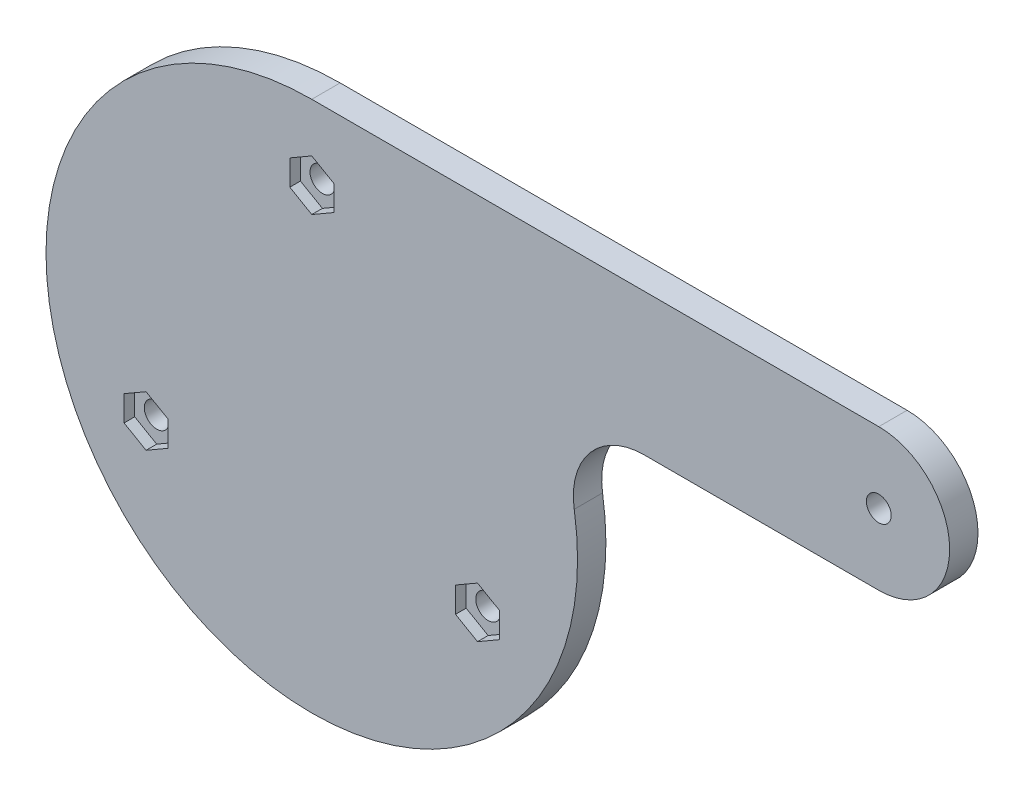
ISO-10303-21;
HEADER;
FILE_DESCRIPTION(('STEP AP214'),'2;1');
FILE_NAME('part.step','',(''),(''),'','','');
FILE_SCHEMA(('AUTOMOTIVE_DESIGN { 1 0 10303 214 1 1 1 1 }'));
ENDSEC;
DATA;
#1=APPLICATION_CONTEXT('core data for automotive mechanical design processes');
#2=APPLICATION_PROTOCOL_DEFINITION('international standard','automotive_design',2000,#1);
#3=PRODUCT_CONTEXT('',#1,'mechanical');
#4=PRODUCT('Part','Part','',(#3));
#5=PRODUCT_RELATED_PRODUCT_CATEGORY('part','',(#4));
#6=PRODUCT_DEFINITION_FORMATION('','',#4);
#7=PRODUCT_DEFINITION_CONTEXT('part definition',#1,'design');
#8=PRODUCT_DEFINITION('design','',#6,#7);
#9=PRODUCT_DEFINITION_SHAPE('','',#8);
#10=(LENGTH_UNIT() NAMED_UNIT(*) SI_UNIT(.MILLI.,.METRE.));
#11=(NAMED_UNIT(*) PLANE_ANGLE_UNIT() SI_UNIT($,.RADIAN.));
#12=(NAMED_UNIT(*) SI_UNIT($,.STERADIAN.) SOLID_ANGLE_UNIT());
#13=UNCERTAINTY_MEASURE_WITH_UNIT(LENGTH_MEASURE(1.E-05),#10,'distance_accuracy_value','');
#14=(GEOMETRIC_REPRESENTATION_CONTEXT(3) GLOBAL_UNCERTAINTY_ASSIGNED_CONTEXT((#13)) GLOBAL_UNIT_ASSIGNED_CONTEXT((#10,
#11,#12)) REPRESENTATION_CONTEXT('',''));
#15=CARTESIAN_POINT('',(0.,0.,0.));
#16=DIRECTION('',(0.,0.,1.));
#17=DIRECTION('',(1.,0.,0.));
#18=AXIS2_PLACEMENT_3D('',#15,#16,#17);
#19=CARTESIAN_POINT('',(46.9041575982343,7.5,4.));
#20=DIRECTION('',(0.,0.,-1.));
#21=DIRECTION('',(-1.,0.,0.));
#22=AXIS2_PLACEMENT_3D('',#19,#20,#21);
#23=CYLINDRICAL_SURFACE('',#22,10.);
#24=CARTESIAN_POINT('',(46.9041575982343,7.5,0.));
#25=DIRECTION('',(0.,0.,1.));
#26=DIRECTION('',(1.,0.,0.));
#27=AXIS2_PLACEMENT_3D('',#24,#25,#26);
#28=CIRCLE('',#27,10.);
#29=CARTESIAN_POINT('',(46.9041575982343,17.5,0.));
#30=VERTEX_POINT('',#29);
#31=CARTESIAN_POINT('',(37.0295981038692,5.92105263157895,0.));
#32=VERTEX_POINT('',#31);
#33=EDGE_CURVE('E244',#30,#32,#28,.T.);
#34=ORIENTED_EDGE('',*,*,#33,.F.);
#35=DIRECTION('',(0.,0.,-1.));
#36=VECTOR('',#35,1.);
#37=CARTESIAN_POINT('',(46.9041575982343,17.5,4.));
#38=LINE('',#37,#36);
#39=CARTESIAN_POINT('',(46.9041575982343,17.5,4.));
#40=VERTEX_POINT('',#39);
#41=EDGE_CURVE('E11',#40,#30,#38,.T.);
#42=ORIENTED_EDGE('',*,*,#41,.F.);
#43=CARTESIAN_POINT('',(46.9041575982343,7.5,4.));
#44=DIRECTION('',(0.,0.,1.));
#45=DIRECTION('',(1.,0.,0.));
#46=AXIS2_PLACEMENT_3D('',#43,#44,#45);
#47=CIRCLE('',#46,10.);
#48=CARTESIAN_POINT('',(37.0295981038692,5.92105263157895,4.));
#49=VERTEX_POINT('',#48);
#50=EDGE_CURVE('E345',#40,#49,#47,.T.);
#51=ORIENTED_EDGE('',*,*,#50,.T.);
#52=DIRECTION('',(0.,0.,-1.));
#53=VECTOR('',#52,1.);
#54=CARTESIAN_POINT('',(37.0295981038692,5.92105263157895,4.));
#55=LINE('',#54,#53);
#56=EDGE_CURVE('E359',#49,#32,#55,.T.);
#57=ORIENTED_EDGE('',*,*,#56,.T.);
#58=EDGE_LOOP('',(#34,#42,#51,#57));
#59=FACE_BOUND('',#58,.T.);
#60=ADVANCED_FACE('F38',(#59),#23,.F.);
#61=CARTESIAN_POINT('',(0.,17.5,4.));
#62=DIRECTION('',(0.,-1.,0.));
#63=DIRECTION('',(1.,0.,0.));
#64=AXIS2_PLACEMENT_3D('',#61,#62,#63);
#65=PLANE('',#64);
#66=DIRECTION('',(-1.,0.,0.));
#67=VECTOR('',#66,1.);
#68=CARTESIAN_POINT('',(0.,17.5,0.));
#69=LINE('',#68,#67);
#70=CARTESIAN_POINT('',(80.,17.5,0.));
#71=VERTEX_POINT('',#70);
#72=EDGE_CURVE('E362',#71,#30,#69,.T.);
#73=ORIENTED_EDGE('',*,*,#72,.F.);
#74=DIRECTION('',(0.,0.,-1.));
#75=VECTOR('',#74,1.);
#76=CARTESIAN_POINT('',(80.,17.5,4.));
#77=LINE('',#76,#75);
#78=CARTESIAN_POINT('',(80.,17.5,4.));
#79=VERTEX_POINT('',#78);
#80=EDGE_CURVE('E46',#79,#71,#77,.T.);
#81=ORIENTED_EDGE('',*,*,#80,.F.);
#82=DIRECTION('',(-1.,0.,0.));
#83=VECTOR('',#82,1.);
#84=CARTESIAN_POINT('',(0.,17.5,4.));
#85=LINE('',#84,#83);
#86=EDGE_CURVE('E348',#79,#40,#85,.T.);
#87=ORIENTED_EDGE('',*,*,#86,.T.);
#88=ORIENTED_EDGE('',*,*,#41,.T.);
#89=EDGE_LOOP('',(#73,#81,#87,#88));
#90=FACE_BOUND('',#89,.T.);
#91=ADVANCED_FACE('F417',(#90),#65,.T.);
#92=CARTESIAN_POINT('',(80.,27.5,4.));
#93=DIRECTION('',(0.,0.,-1.));
#94=DIRECTION('',(-1.,0.,0.));
#95=AXIS2_PLACEMENT_3D('',#92,#93,#94);
#96=CYLINDRICAL_SURFACE('',#95,9.99999999999999);
#97=CARTESIAN_POINT('',(80.,27.5,0.));
#98=DIRECTION('',(0.,0.,1.));
#99=DIRECTION('',(1.,0.,0.));
#100=AXIS2_PLACEMENT_3D('',#97,#98,#99);
#101=CIRCLE('',#100,9.99999999999999);
#102=CARTESIAN_POINT('',(80.,37.5,0.));
#103=VERTEX_POINT('',#102);
#104=EDGE_CURVE('E365',#71,#103,#101,.T.);
#105=ORIENTED_EDGE('',*,*,#104,.T.);
#106=DIRECTION('',(0.,0.,-1.));
#107=VECTOR('',#106,1.);
#108=CARTESIAN_POINT('',(80.,37.5,4.));
#109=LINE('',#108,#107);
#110=CARTESIAN_POINT('',(80.,37.5,4.));
#111=VERTEX_POINT('',#110);
#112=EDGE_CURVE('E376',#111,#103,#109,.T.);
#113=ORIENTED_EDGE('',*,*,#112,.F.);
#114=CARTESIAN_POINT('',(80.,27.5,4.));
#115=DIRECTION('',(0.,0.,1.));
#116=DIRECTION('',(1.,0.,0.));
#117=AXIS2_PLACEMENT_3D('',#114,#115,#116);
#118=CIRCLE('',#117,9.99999999999999);
#119=EDGE_CURVE('E352',#79,#111,#118,.T.);
#120=ORIENTED_EDGE('',*,*,#119,.F.);
#121=ORIENTED_EDGE('',*,*,#80,.T.);
#122=EDGE_LOOP('',(#105,#113,#120,#121));
#123=FACE_BOUND('',#122,.T.);
#124=ADVANCED_FACE('F422',(#123),#96,.T.);
#125=CARTESIAN_POINT('',(0.,37.5,4.));
#126=DIRECTION('',(0.,1.,0.));
#127=DIRECTION('',(0.,0.,1.));
#128=AXIS2_PLACEMENT_3D('',#125,#126,#127);
#129=PLANE('',#128);
#130=DIRECTION('',(1.,0.,0.));
#131=VECTOR('',#130,1.);
#132=CARTESIAN_POINT('',(0.,37.5,0.));
#133=LINE('',#132,#131);
#134=CARTESIAN_POINT('',(0.,37.5,0.));
#135=VERTEX_POINT('',#134);
#136=EDGE_CURVE('E368',#135,#103,#133,.T.);
#137=ORIENTED_EDGE('',*,*,#136,.F.);
#138=DIRECTION('',(0.,0.,-1.));
#139=VECTOR('',#138,1.);
#140=CARTESIAN_POINT('',(0.,37.5,4.));
#141=LINE('',#140,#139);
#142=CARTESIAN_POINT('',(0.,37.5,4.));
#143=VERTEX_POINT('',#142);
#144=EDGE_CURVE('E374',#143,#135,#141,.T.);
#145=ORIENTED_EDGE('',*,*,#144,.F.);
#146=DIRECTION('',(1.,0.,0.));
#147=VECTOR('',#146,1.);
#148=CARTESIAN_POINT('',(0.,37.5,4.));
#149=LINE('',#148,#147);
#150=EDGE_CURVE('E354',#143,#111,#149,.T.);
#151=ORIENTED_EDGE('',*,*,#150,.T.);
#152=ORIENTED_EDGE('',*,*,#112,.T.);
#153=EDGE_LOOP('',(#137,#145,#151,#152));
#154=FACE_BOUND('',#153,.T.);
#155=ADVANCED_FACE('F442',(#154),#129,.T.);
#156=CARTESIAN_POINT('',(0.,0.,4.));
#157=DIRECTION('',(0.,0.,-1.));
#158=DIRECTION('',(-1.,0.,0.));
#159=AXIS2_PLACEMENT_3D('',#156,#157,#158);
#160=CYLINDRICAL_SURFACE('',#159,37.5);
#161=CARTESIAN_POINT('',(0.,0.,0.));
#162=DIRECTION('',(0.,0.,1.));
#163=DIRECTION('',(1.,0.,0.));
#164=AXIS2_PLACEMENT_3D('',#161,#162,#163);
#165=CIRCLE('',#164,37.5);
#166=EDGE_CURVE('E349',#135,#32,#165,.T.);
#167=ORIENTED_EDGE('',*,*,#166,.T.);
#168=ORIENTED_EDGE('',*,*,#56,.F.);
#169=CARTESIAN_POINT('',(0.,0.,4.));
#170=DIRECTION('',(0.,0.,1.));
#171=DIRECTION('',(1.,0.,0.));
#172=AXIS2_PLACEMENT_3D('',#169,#170,#171);
#173=CIRCLE('',#172,37.5);
#174=EDGE_CURVE('E357',#143,#49,#173,.T.);
#175=ORIENTED_EDGE('',*,*,#174,.F.);
#176=ORIENTED_EDGE('',*,*,#144,.T.);
#177=EDGE_LOOP('',(#167,#168,#175,#176));
#178=FACE_BOUND('',#177,.T.);
#179=ADVANCED_FACE('F439',(#178),#160,.T.);
#180=CARTESIAN_POINT('',(0.,0.,4.));
#181=DIRECTION('',(0.,0.,1.));
#182=DIRECTION('',(1.,0.,0.));
#183=AXIS2_PLACEMENT_3D('',#180,#181,#182);
#184=PLANE('',#183);
#185=CARTESIAN_POINT('',(80.,27.5,4.));
#186=DIRECTION('',(0.,0.,1.));
#187=DIRECTION('',(1.,0.,0.));
#188=AXIS2_PLACEMENT_3D('',#185,#186,#187);
#189=CIRCLE('',#188,1.75);
#190=CARTESIAN_POINT('',(81.75,27.5,4.));
#191=VERTEX_POINT('',#190);
#192=EDGE_CURVE('E397',#191,#191,#189,.T.);
#193=ORIENTED_EDGE('',*,*,#192,.F.);
#194=EDGE_LOOP('',(#193));
#195=FACE_BOUND('',#194,.T.);
#196=DIRECTION('',(0.866025403784438,0.5,0.));
#197=VECTOR('',#196,1.);
#198=CARTESIAN_POINT('',(23.3826859021808,-17.0799999999994,4.));
#199=LINE('',#198,#197);
#200=CARTESIAN_POINT('',(23.3826859021808,-17.0799999999994,4.));
#201=VERTEX_POINT('',#200);
#202=CARTESIAN_POINT('',(26.4830568477291,-15.2899999999994,4.));
#203=VERTEX_POINT('',#202);
#204=EDGE_CURVE('E54',#201,#203,#199,.T.);
#205=ORIENTED_EDGE('',*,*,#204,.F.);
#206=DIRECTION('',(0.866025403784439,-0.5,0.));
#207=VECTOR('',#206,1.);
#208=CARTESIAN_POINT('',(20.2823149566325,-15.2899999999994,4.));
#209=LINE('',#208,#207);
#210=CARTESIAN_POINT('',(20.2823149566325,-15.2899999999994,4.));
#211=VERTEX_POINT('',#210);
#212=EDGE_CURVE('E214',#211,#201,#209,.T.);
#213=ORIENTED_EDGE('',*,*,#212,.F.);
#214=DIRECTION('',(0.,-1.,0.));
#215=VECTOR('',#214,1.);
#216=CARTESIAN_POINT('',(20.2823149566325,-11.7099999999994,4.));
#217=LINE('',#216,#215);
#218=CARTESIAN_POINT('',(20.2823149566325,-11.7099999999994,4.));
#219=VERTEX_POINT('',#218);
#220=EDGE_CURVE('E217',#219,#211,#217,.T.);
#221=ORIENTED_EDGE('',*,*,#220,.F.);
#222=DIRECTION('',(-0.866025403784439,-0.5,0.));
#223=VECTOR('',#222,1.);
#224=CARTESIAN_POINT('',(23.3826859021808,-9.91999999999944,4.));
#225=LINE('',#224,#223);
#226=CARTESIAN_POINT('',(23.3826859021808,-9.91999999999944,4.));
#227=VERTEX_POINT('',#226);
#228=EDGE_CURVE('E237',#227,#219,#225,.T.);
#229=ORIENTED_EDGE('',*,*,#228,.F.);
#230=DIRECTION('',(-0.866025403784439,0.5,0.));
#231=VECTOR('',#230,1.);
#232=CARTESIAN_POINT('',(26.4830568477291,-11.7099999999994,4.));
#233=LINE('',#232,#231);
#234=CARTESIAN_POINT('',(26.4830568477291,-11.7099999999994,4.));
#235=VERTEX_POINT('',#234);
#236=EDGE_CURVE('E234',#235,#227,#233,.T.);
#237=ORIENTED_EDGE('',*,*,#236,.F.);
#238=DIRECTION('',(0.,1.,0.));
#239=VECTOR('',#238,1.);
#240=CARTESIAN_POINT('',(26.4830568477291,-15.2899999999994,4.));
#241=LINE('',#240,#239);
#242=EDGE_CURVE('E231',#203,#235,#241,.T.);
#243=ORIENTED_EDGE('',*,*,#242,.F.);
#244=EDGE_LOOP('',(#205,#213,#221,#229,#237,#243));
#245=FACE_BOUND('',#244,.T.);
#246=DIRECTION('',(-0.866025403784439,0.5,0.));
#247=VECTOR('',#246,1.);
#248=CARTESIAN_POINT('',(3.1003709455483,28.79,4.));
#249=LINE('',#248,#247);
#250=CARTESIAN_POINT('',(3.1003709455483,28.79,4.));
#251=VERTEX_POINT('',#250);
#252=CARTESIAN_POINT('',(0.,30.58,4.));
#253=VERTEX_POINT('',#252);
#254=EDGE_CURVE('E62',#251,#253,#249,.T.);
#255=ORIENTED_EDGE('',*,*,#254,.F.);
#256=DIRECTION('',(0.,1.,0.));
#257=VECTOR('',#256,1.);
#258=CARTESIAN_POINT('',(3.1003709455483,25.21,4.));
#259=LINE('',#258,#257);
#260=CARTESIAN_POINT('',(3.1003709455483,25.21,4.));
#261=VERTEX_POINT('',#260);
#262=EDGE_CURVE('E256',#261,#251,#259,.T.);
#263=ORIENTED_EDGE('',*,*,#262,.F.);
#264=DIRECTION('',(0.866025403784438,0.500000000000001,0.));
#265=VECTOR('',#264,1.);
#266=CARTESIAN_POINT('',(0.,23.42,4.));
#267=LINE('',#266,#265);
#268=CARTESIAN_POINT('',(0.,23.42,4.));
#269=VERTEX_POINT('',#268);
#270=EDGE_CURVE('E283',#269,#261,#267,.T.);
#271=ORIENTED_EDGE('',*,*,#270,.F.);
#272=DIRECTION('',(0.866025403784438,-0.5,0.));
#273=VECTOR('',#272,1.);
#274=CARTESIAN_POINT('',(-3.10037094554829,25.21,4.));
#275=LINE('',#274,#273);
#276=CARTESIAN_POINT('',(-3.10037094554829,25.21,4.));
#277=VERTEX_POINT('',#276);
#278=EDGE_CURVE('E280',#277,#269,#275,.T.);
#279=ORIENTED_EDGE('',*,*,#278,.F.);
#280=DIRECTION('',(0.,-1.,0.));
#281=VECTOR('',#280,1.);
#282=CARTESIAN_POINT('',(-3.10037094554829,28.79,4.));
#283=LINE('',#282,#281);
#284=CARTESIAN_POINT('',(-3.10037094554829,28.79,4.));
#285=VERTEX_POINT('',#284);
#286=EDGE_CURVE('E277',#285,#277,#283,.T.);
#287=ORIENTED_EDGE('',*,*,#286,.F.);
#288=DIRECTION('',(-0.866025403784438,-0.500000000000001,0.));
#289=VECTOR('',#288,1.);
#290=CARTESIAN_POINT('',(0.,30.58,4.));
#291=LINE('',#290,#289);
#292=EDGE_CURVE('E273',#253,#285,#291,.T.);
#293=ORIENTED_EDGE('',*,*,#292,.F.);
#294=EDGE_LOOP('',(#255,#263,#271,#279,#287,#293));
#295=FACE_BOUND('',#294,.T.);
#296=DIRECTION('',(0.,-1.,0.));
#297=VECTOR('',#296,1.);
#298=CARTESIAN_POINT('',(-26.4830568477271,-11.7100000000006,4.));
#299=LINE('',#298,#297);
#300=CARTESIAN_POINT('',(-26.4830568477271,-11.7100000000006,4.));
#301=VERTEX_POINT('',#300);
#302=CARTESIAN_POINT('',(-26.4830568477271,-15.2900000000006,4.));
#303=VERTEX_POINT('',#302);
#304=EDGE_CURVE('E318',#301,#303,#299,.T.);
#305=ORIENTED_EDGE('',*,*,#304,.F.);
#306=DIRECTION('',(-0.866025403784439,-0.5,0.));
#307=VECTOR('',#306,1.);
#308=CARTESIAN_POINT('',(-23.3826859021788,-9.92000000000058,4.));
#309=LINE('',#308,#307);
#310=CARTESIAN_POINT('',(-23.3826859021788,-9.92000000000058,4.));
#311=VERTEX_POINT('',#310);
#312=EDGE_CURVE('E302',#311,#301,#309,.T.);
#313=ORIENTED_EDGE('',*,*,#312,.F.);
#314=DIRECTION('',(-0.866025403784438,0.5,0.));
#315=VECTOR('',#314,1.);
#316=CARTESIAN_POINT('',(-20.2823149566306,-11.7100000000006,4.));
#317=LINE('',#316,#315);
#318=CARTESIAN_POINT('',(-20.2823149566306,-11.7100000000006,4.));
#319=VERTEX_POINT('',#318);
#320=EDGE_CURVE('E329',#319,#311,#317,.T.);
#321=ORIENTED_EDGE('',*,*,#320,.F.);
#322=DIRECTION('',(0.,1.,0.));
#323=VECTOR('',#322,1.);
#324=CARTESIAN_POINT('',(-20.2823149566306,-15.2900000000006,4.));
#325=LINE('',#324,#323);
#326=CARTESIAN_POINT('',(-20.2823149566306,-15.2900000000006,4.));
#327=VERTEX_POINT('',#326);
#328=EDGE_CURVE('E326',#327,#319,#325,.T.);
#329=ORIENTED_EDGE('',*,*,#328,.F.);
#330=DIRECTION('',(0.866025403784438,0.500000000000001,0.));
#331=VECTOR('',#330,1.);
#332=CARTESIAN_POINT('',(-23.3826859021788,-17.0800000000006,4.));
#333=LINE('',#332,#331);
#334=CARTESIAN_POINT('',(-23.3826859021788,-17.0800000000006,4.));
#335=VERTEX_POINT('',#334);
#336=EDGE_CURVE('E323',#335,#327,#333,.T.);
#337=ORIENTED_EDGE('',*,*,#336,.F.);
#338=DIRECTION('',(0.866025403784439,-0.499999999999999,0.));
#339=VECTOR('',#338,1.);
#340=CARTESIAN_POINT('',(-26.4830568477271,-15.2900000000006,4.));
#341=LINE('',#340,#339);
#342=EDGE_CURVE('E320',#303,#335,#341,.T.);
#343=ORIENTED_EDGE('',*,*,#342,.F.);
#344=EDGE_LOOP('',(#305,#313,#321,#329,#337,#343));
#345=FACE_BOUND('',#344,.T.);
#346=ORIENTED_EDGE('',*,*,#50,.F.);
#347=ORIENTED_EDGE('',*,*,#86,.F.);
#348=ORIENTED_EDGE('',*,*,#119,.T.);
#349=ORIENTED_EDGE('',*,*,#150,.F.);
#350=ORIENTED_EDGE('',*,*,#174,.T.);
#351=EDGE_LOOP('',(#346,#347,#348,#349,#350));
#352=FACE_BOUND('',#351,.T.);
#353=ADVANCED_FACE('F434',(#195,#245,#295,#345,#352),#184,.T.);
#354=CARTESIAN_POINT('',(0.,0.,0.));
#355=DIRECTION('',(0.,0.,1.));
#356=DIRECTION('',(1.,0.,0.));
#357=AXIS2_PLACEMENT_3D('',#354,#355,#356);
#358=PLANE('',#357);
#359=CARTESIAN_POINT('',(80.,27.5,0.));
#360=DIRECTION('',(0.,0.,1.));
#361=DIRECTION('',(1.,0.,0.));
#362=AXIS2_PLACEMENT_3D('',#359,#360,#361);
#363=CIRCLE('',#362,1.75);
#364=CARTESIAN_POINT('',(81.75,27.5,0.));
#365=VERTEX_POINT('',#364);
#366=EDGE_CURVE('E41',#365,#365,#363,.T.);
#367=ORIENTED_EDGE('',*,*,#366,.T.);
#368=EDGE_LOOP('',(#367));
#369=FACE_BOUND('',#368,.T.);
#370=CARTESIAN_POINT('',(0.,27.,0.));
#371=DIRECTION('',(0.,0.,1.));
#372=DIRECTION('',(1.,0.,0.));
#373=AXIS2_PLACEMENT_3D('',#370,#371,#372);
#374=CIRCLE('',#373,1.75);
#375=CARTESIAN_POINT('',(1.75,27.,0.));
#376=VERTEX_POINT('',#375);
#377=EDGE_CURVE('E385',#376,#376,#374,.T.);
#378=ORIENTED_EDGE('',*,*,#377,.T.);
#379=EDGE_LOOP('',(#378));
#380=FACE_BOUND('',#379,.T.);
#381=CARTESIAN_POINT('',(23.3826859021816,-13.499999999999,0.));
#382=DIRECTION('',(0.,0.,1.));
#383=DIRECTION('',(1.,0.,0.));
#384=AXIS2_PLACEMENT_3D('',#381,#382,#383);
#385=CIRCLE('',#384,1.75000000000148);
#386=CARTESIAN_POINT('',(25.132685902183,-13.499999999999,0.));
#387=VERTEX_POINT('',#386);
#388=EDGE_CURVE('E382',#387,#387,#385,.T.);
#389=ORIENTED_EDGE('',*,*,#388,.T.);
#390=EDGE_LOOP('',(#389));
#391=FACE_BOUND('',#390,.T.);
#392=CARTESIAN_POINT('',(-23.3826859021781,-13.500000000001,0.));
#393=DIRECTION('',(0.,0.,1.));
#394=DIRECTION('',(1.,0.,0.));
#395=AXIS2_PLACEMENT_3D('',#392,#393,#394);
#396=CIRCLE('',#395,1.75000000000219);
#397=CARTESIAN_POINT('',(-21.6326859021759,-13.500000000001,0.));
#398=VERTEX_POINT('',#397);
#399=EDGE_CURVE('E220',#398,#398,#396,.T.);
#400=ORIENTED_EDGE('',*,*,#399,.T.);
#401=EDGE_LOOP('',(#400));
#402=FACE_BOUND('',#401,.T.);
#403=ORIENTED_EDGE('',*,*,#33,.T.);
#404=ORIENTED_EDGE('',*,*,#166,.F.);
#405=ORIENTED_EDGE('',*,*,#136,.T.);
#406=ORIENTED_EDGE('',*,*,#104,.F.);
#407=ORIENTED_EDGE('',*,*,#72,.T.);
#408=EDGE_LOOP('',(#403,#404,#405,#406,#407));
#409=FACE_BOUND('',#408,.T.);
#410=ADVANCED_FACE('F404',(#369,#380,#391,#402,#409),#358,.F.);
#411=CARTESIAN_POINT('',(-26.4830568477271,-11.7100000000006,2.5));
#412=DIRECTION('',(-1.,0.,0.));
#413=DIRECTION('',(0.,0.,1.));
#414=AXIS2_PLACEMENT_3D('',#411,#412,#413);
#415=PLANE('',#414);
#416=ORIENTED_EDGE('',*,*,#304,.T.);
#417=DIRECTION('',(0.,0.,1.));
#418=VECTOR('',#417,1.);
#419=CARTESIAN_POINT('',(-26.4830568477271,-15.2900000000006,2.5));
#420=LINE('',#419,#418);
#421=CARTESIAN_POINT('',(-26.4830568477271,-15.2900000000006,2.5));
#422=VERTEX_POINT('',#421);
#423=EDGE_CURVE('E317',#422,#303,#420,.T.);
#424=ORIENTED_EDGE('',*,*,#423,.F.);
#425=DIRECTION('',(0.,-1.,0.));
#426=VECTOR('',#425,1.);
#427=CARTESIAN_POINT('',(-26.4830568477271,-11.7100000000006,2.5));
#428=LINE('',#427,#426);
#429=CARTESIAN_POINT('',(-26.4830568477271,-11.7100000000006,2.5));
#430=VERTEX_POINT('',#429);
#431=EDGE_CURVE('E298',#430,#422,#428,.T.);
#432=ORIENTED_EDGE('',*,*,#431,.F.);
#433=DIRECTION('',(0.,0.,1.));
#434=VECTOR('',#433,1.);
#435=CARTESIAN_POINT('',(-26.4830568477271,-11.7100000000006,2.5));
#436=LINE('',#435,#434);
#437=EDGE_CURVE('E274',#430,#301,#436,.T.);
#438=ORIENTED_EDGE('',*,*,#437,.T.);
#439=EDGE_LOOP('',(#416,#424,#432,#438));
#440=FACE_BOUND('',#439,.T.);
#441=ADVANCED_FACE('F455',(#440),#415,.F.);
#442=CARTESIAN_POINT('',(-23.3826859021788,-9.92000000000058,2.5));
#443=DIRECTION('',(-0.5,0.866025403784438,0.));
#444=DIRECTION('',(-0.866025403784439,-0.5,0.));
#445=AXIS2_PLACEMENT_3D('',#442,#443,#444);
#446=PLANE('',#445);
#447=ORIENTED_EDGE('',*,*,#312,.T.);
#448=ORIENTED_EDGE('',*,*,#437,.F.);
#449=DIRECTION('',(-0.866025403784439,-0.5,0.));
#450=VECTOR('',#449,1.);
#451=CARTESIAN_POINT('',(-23.3826859021788,-9.92000000000058,2.5));
#452=LINE('',#451,#450);
#453=CARTESIAN_POINT('',(-23.3826859021788,-9.92000000000058,2.5));
#454=VERTEX_POINT('',#453);
#455=EDGE_CURVE('E314',#454,#430,#452,.T.);
#456=ORIENTED_EDGE('',*,*,#455,.F.);
#457=DIRECTION('',(0.,0.,1.));
#458=VECTOR('',#457,1.);
#459=CARTESIAN_POINT('',(-23.3826859021788,-9.92000000000058,2.5));
#460=LINE('',#459,#458);
#461=EDGE_CURVE('E335',#454,#311,#460,.T.);
#462=ORIENTED_EDGE('',*,*,#461,.T.);
#463=EDGE_LOOP('',(#447,#448,#456,#462));
#464=FACE_BOUND('',#463,.T.);
#465=ADVANCED_FACE('F461',(#464),#446,.F.);
#466=CARTESIAN_POINT('',(-20.2823149566306,-11.7100000000006,2.5));
#467=DIRECTION('',(0.500000000000001,0.866025403784438,0.));
#468=DIRECTION('',(-0.866025403784438,0.500000000000001,0.));
#469=AXIS2_PLACEMENT_3D('',#466,#467,#468);
#470=PLANE('',#469);
#471=ORIENTED_EDGE('',*,*,#320,.T.);
#472=ORIENTED_EDGE('',*,*,#461,.F.);
#473=DIRECTION('',(-0.866025403784438,0.5,0.));
#474=VECTOR('',#473,1.);
#475=CARTESIAN_POINT('',(-20.2823149566306,-11.7100000000006,2.5));
#476=LINE('',#475,#474);
#477=CARTESIAN_POINT('',(-20.2823149566306,-11.7100000000006,2.5));
#478=VERTEX_POINT('',#477);
#479=EDGE_CURVE('E311',#478,#454,#476,.T.);
#480=ORIENTED_EDGE('',*,*,#479,.F.);
#481=DIRECTION('',(0.,0.,1.));
#482=VECTOR('',#481,1.);
#483=CARTESIAN_POINT('',(-20.2823149566306,-11.7100000000006,2.5));
#484=LINE('',#483,#482);
#485=EDGE_CURVE('E337',#478,#319,#484,.T.);
#486=ORIENTED_EDGE('',*,*,#485,.T.);
#487=EDGE_LOOP('',(#471,#472,#480,#486));
#488=FACE_BOUND('',#487,.T.);
#489=ADVANCED_FACE('F475',(#488),#470,.F.);
#490=CARTESIAN_POINT('',(-20.2823149566306,-15.2900000000006,2.5));
#491=DIRECTION('',(1.,0.,0.));
#492=DIRECTION('',(0.,0.,-1.));
#493=AXIS2_PLACEMENT_3D('',#490,#491,#492);
#494=PLANE('',#493);
#495=ORIENTED_EDGE('',*,*,#328,.T.);
#496=ORIENTED_EDGE('',*,*,#485,.F.);
#497=DIRECTION('',(0.,1.,0.));
#498=VECTOR('',#497,1.);
#499=CARTESIAN_POINT('',(-20.2823149566306,-15.2900000000006,2.5));
#500=LINE('',#499,#498);
#501=CARTESIAN_POINT('',(-20.2823149566306,-15.2900000000006,2.5));
#502=VERTEX_POINT('',#501);
#503=EDGE_CURVE('E308',#502,#478,#500,.T.);
#504=ORIENTED_EDGE('',*,*,#503,.F.);
#505=DIRECTION('',(0.,0.,1.));
#506=VECTOR('',#505,1.);
#507=CARTESIAN_POINT('',(-20.2823149566306,-15.2900000000006,2.5));
#508=LINE('',#507,#506);
#509=EDGE_CURVE('E339',#502,#327,#508,.T.);
#510=ORIENTED_EDGE('',*,*,#509,.T.);
#511=EDGE_LOOP('',(#495,#496,#504,#510));
#512=FACE_BOUND('',#511,.T.);
#513=ADVANCED_FACE('F471',(#512),#494,.F.);
#514=CARTESIAN_POINT('',(-23.3826859021788,-17.0800000000006,2.5));
#515=DIRECTION('',(0.500000000000001,-0.866025403784438,0.));
#516=DIRECTION('',(0.866025403784438,0.500000000000001,0.));
#517=AXIS2_PLACEMENT_3D('',#514,#515,#516);
#518=PLANE('',#517);
#519=ORIENTED_EDGE('',*,*,#336,.T.);
#520=ORIENTED_EDGE('',*,*,#509,.F.);
#521=DIRECTION('',(0.866025403784438,0.500000000000001,0.));
#522=VECTOR('',#521,1.);
#523=CARTESIAN_POINT('',(-23.3826859021788,-17.0800000000006,2.5));
#524=LINE('',#523,#522);
#525=CARTESIAN_POINT('',(-23.3826859021788,-17.0800000000006,2.5));
#526=VERTEX_POINT('',#525);
#527=EDGE_CURVE('E305',#526,#502,#524,.T.);
#528=ORIENTED_EDGE('',*,*,#527,.F.);
#529=DIRECTION('',(0.,0.,1.));
#530=VECTOR('',#529,1.);
#531=CARTESIAN_POINT('',(-23.3826859021788,-17.0800000000006,2.5));
#532=LINE('',#531,#530);
#533=EDGE_CURVE('E341',#526,#335,#532,.T.);
#534=ORIENTED_EDGE('',*,*,#533,.T.);
#535=EDGE_LOOP('',(#519,#520,#528,#534));
#536=FACE_BOUND('',#535,.T.);
#537=ADVANCED_FACE('F467',(#536),#518,.F.);
#538=CARTESIAN_POINT('',(-26.4830568477271,-15.2900000000006,2.5));
#539=DIRECTION('',(-0.499999999999999,-0.866025403784439,0.));
#540=DIRECTION('',(0.866025403784439,-0.499999999999999,0.));
#541=AXIS2_PLACEMENT_3D('',#538,#539,#540);
#542=PLANE('',#541);
#543=ORIENTED_EDGE('',*,*,#342,.T.);
#544=ORIENTED_EDGE('',*,*,#533,.F.);
#545=DIRECTION('',(0.866025403784439,-0.499999999999999,0.));
#546=VECTOR('',#545,1.);
#547=CARTESIAN_POINT('',(-26.4830568477271,-15.2900000000006,2.5));
#548=LINE('',#547,#546);
#549=EDGE_CURVE('E301',#422,#526,#548,.T.);
#550=ORIENTED_EDGE('',*,*,#549,.F.);
#551=ORIENTED_EDGE('',*,*,#423,.T.);
#552=EDGE_LOOP('',(#543,#544,#550,#551));
#553=FACE_BOUND('',#552,.T.);
#554=ADVANCED_FACE('F463',(#553),#542,.F.);
#555=CARTESIAN_POINT('',(0.,0.,2.5));
#556=DIRECTION('',(0.,0.,1.));
#557=DIRECTION('',(1.,0.,0.));
#558=AXIS2_PLACEMENT_3D('',#555,#556,#557);
#559=PLANE('',#558);
#560=CARTESIAN_POINT('',(-23.3826859021781,-13.500000000001,2.5));
#561=DIRECTION('',(0.,0.,1.));
#562=DIRECTION('',(1.,0.,0.));
#563=AXIS2_PLACEMENT_3D('',#560,#561,#562);
#564=CIRCLE('',#563,1.75000000000219);
#565=CARTESIAN_POINT('',(-21.6326859021759,-13.500000000001,2.5));
#566=VERTEX_POINT('',#565);
#567=EDGE_CURVE('E386',#566,#566,#564,.T.);
#568=ORIENTED_EDGE('',*,*,#567,.F.);
#569=EDGE_LOOP('',(#568));
#570=FACE_BOUND('',#569,.T.);
#571=ORIENTED_EDGE('',*,*,#431,.T.);
#572=ORIENTED_EDGE('',*,*,#549,.T.);
#573=ORIENTED_EDGE('',*,*,#527,.T.);
#574=ORIENTED_EDGE('',*,*,#503,.T.);
#575=ORIENTED_EDGE('',*,*,#479,.T.);
#576=ORIENTED_EDGE('',*,*,#455,.T.);
#577=EDGE_LOOP('',(#571,#572,#573,#574,#575,#576));
#578=FACE_BOUND('',#577,.T.);
#579=ADVANCED_FACE('F466',(#570,#578),#559,.T.);
#580=CARTESIAN_POINT('',(3.1003709455483,28.79,2.5));
#581=DIRECTION('',(0.5,0.866025403784439,0.));
#582=DIRECTION('',(-0.866025403784439,0.5,0.));
#583=AXIS2_PLACEMENT_3D('',#580,#581,#582);
#584=PLANE('',#583);
#585=ORIENTED_EDGE('',*,*,#254,.T.);
#586=DIRECTION('',(0.,0.,1.));
#587=VECTOR('',#586,1.);
#588=CARTESIAN_POINT('',(0.,30.58,2.5));
#589=LINE('',#588,#587);
#590=CARTESIAN_POINT('',(0.,30.58,2.5));
#591=VERTEX_POINT('',#590);
#592=EDGE_CURVE('E271',#591,#253,#589,.T.);
#593=ORIENTED_EDGE('',*,*,#592,.F.);
#594=DIRECTION('',(-0.866025403784439,0.5,0.));
#595=VECTOR('',#594,1.);
#596=CARTESIAN_POINT('',(3.1003709455483,28.79,2.5));
#597=LINE('',#596,#595);
#598=CARTESIAN_POINT('',(3.1003709455483,28.79,2.5));
#599=VERTEX_POINT('',#598);
#600=EDGE_CURVE('E252',#599,#591,#597,.T.);
#601=ORIENTED_EDGE('',*,*,#600,.F.);
#602=DIRECTION('',(0.,0.,1.));
#603=VECTOR('',#602,1.);
#604=CARTESIAN_POINT('',(3.1003709455483,28.79,2.5));
#605=LINE('',#604,#603);
#606=EDGE_CURVE('E232',#599,#251,#605,.T.);
#607=ORIENTED_EDGE('',*,*,#606,.T.);
#608=EDGE_LOOP('',(#585,#593,#601,#607));
#609=FACE_BOUND('',#608,.T.);
#610=ADVANCED_FACE('F485',(#609),#584,.F.);
#611=CARTESIAN_POINT('',(3.1003709455483,25.21,2.5));
#612=DIRECTION('',(1.,0.,0.));
#613=DIRECTION('',(0.,0.,-1.));
#614=AXIS2_PLACEMENT_3D('',#611,#612,#613);
#615=PLANE('',#614);
#616=ORIENTED_EDGE('',*,*,#262,.T.);
#617=ORIENTED_EDGE('',*,*,#606,.F.);
#618=DIRECTION('',(0.,1.,0.));
#619=VECTOR('',#618,1.);
#620=CARTESIAN_POINT('',(3.1003709455483,25.21,2.5));
#621=LINE('',#620,#619);
#622=CARTESIAN_POINT('',(3.1003709455483,25.21,2.5));
#623=VERTEX_POINT('',#622);
#624=EDGE_CURVE('E268',#623,#599,#621,.T.);
#625=ORIENTED_EDGE('',*,*,#624,.F.);
#626=DIRECTION('',(0.,0.,1.));
#627=VECTOR('',#626,1.);
#628=CARTESIAN_POINT('',(3.1003709455483,25.21,2.5));
#629=LINE('',#628,#627);
#630=EDGE_CURVE('E289',#623,#261,#629,.T.);
#631=ORIENTED_EDGE('',*,*,#630,.T.);
#632=EDGE_LOOP('',(#616,#617,#625,#631));
#633=FACE_BOUND('',#632,.T.);
#634=ADVANCED_FACE('F489',(#633),#615,.F.);
#635=CARTESIAN_POINT('',(0.,23.42,2.5));
#636=DIRECTION('',(0.500000000000001,-0.866025403784438,0.));
#637=DIRECTION('',(0.866025403784438,0.500000000000001,0.));
#638=AXIS2_PLACEMENT_3D('',#635,#636,#637);
#639=PLANE('',#638);
#640=ORIENTED_EDGE('',*,*,#270,.T.);
#641=ORIENTED_EDGE('',*,*,#630,.F.);
#642=DIRECTION('',(0.866025403784438,0.500000000000001,0.));
#643=VECTOR('',#642,1.);
#644=CARTESIAN_POINT('',(0.,23.42,2.5));
#645=LINE('',#644,#643);
#646=CARTESIAN_POINT('',(0.,23.42,2.5));
#647=VERTEX_POINT('',#646);
#648=EDGE_CURVE('E265',#647,#623,#645,.T.);
#649=ORIENTED_EDGE('',*,*,#648,.F.);
#650=DIRECTION('',(0.,0.,1.));
#651=VECTOR('',#650,1.);
#652=CARTESIAN_POINT('',(0.,23.42,2.5));
#653=LINE('',#652,#651);
#654=EDGE_CURVE('E291',#647,#269,#653,.T.);
#655=ORIENTED_EDGE('',*,*,#654,.T.);
#656=EDGE_LOOP('',(#640,#641,#649,#655));
#657=FACE_BOUND('',#656,.T.);
#658=ADVANCED_FACE('F502',(#657),#639,.F.);
#659=CARTESIAN_POINT('',(-3.10037094554829,25.21,2.5));
#660=DIRECTION('',(-0.5,-0.866025403784438,0.));
#661=DIRECTION('',(0.866025403784438,-0.5,0.));
#662=AXIS2_PLACEMENT_3D('',#659,#660,#661);
#663=PLANE('',#662);
#664=ORIENTED_EDGE('',*,*,#278,.T.);
#665=ORIENTED_EDGE('',*,*,#654,.F.);
#666=DIRECTION('',(0.866025403784438,-0.5,0.));
#667=VECTOR('',#666,1.);
#668=CARTESIAN_POINT('',(-3.10037094554829,25.21,2.5));
#669=LINE('',#668,#667);
#670=CARTESIAN_POINT('',(-3.10037094554829,25.21,2.5));
#671=VERTEX_POINT('',#670);
#672=EDGE_CURVE('E262',#671,#647,#669,.T.);
#673=ORIENTED_EDGE('',*,*,#672,.F.);
#674=DIRECTION('',(0.,0.,1.));
#675=VECTOR('',#674,1.);
#676=CARTESIAN_POINT('',(-3.10037094554829,25.21,2.5));
#677=LINE('',#676,#675);
#678=EDGE_CURVE('E293',#671,#277,#677,.T.);
#679=ORIENTED_EDGE('',*,*,#678,.T.);
#680=EDGE_LOOP('',(#664,#665,#673,#679));
#681=FACE_BOUND('',#680,.T.);
#682=ADVANCED_FACE('F498',(#681),#663,.F.);
#683=CARTESIAN_POINT('',(-3.10037094554829,28.79,2.5));
#684=DIRECTION('',(-1.,0.,0.));
#685=DIRECTION('',(0.,-1.,0.));
#686=AXIS2_PLACEMENT_3D('',#683,#684,#685);
#687=PLANE('',#686);
#688=ORIENTED_EDGE('',*,*,#286,.T.);
#689=ORIENTED_EDGE('',*,*,#678,.F.);
#690=DIRECTION('',(0.,-1.,0.));
#691=VECTOR('',#690,1.);
#692=CARTESIAN_POINT('',(-3.10037094554829,28.79,2.5));
#693=LINE('',#692,#691);
#694=CARTESIAN_POINT('',(-3.10037094554829,28.79,2.5));
#695=VERTEX_POINT('',#694);
#696=EDGE_CURVE('E259',#695,#671,#693,.T.);
#697=ORIENTED_EDGE('',*,*,#696,.F.);
#698=DIRECTION('',(0.,0.,1.));
#699=VECTOR('',#698,1.);
#700=CARTESIAN_POINT('',(-3.10037094554829,28.79,2.5));
#701=LINE('',#700,#699);
#702=EDGE_CURVE('E295',#695,#285,#701,.T.);
#703=ORIENTED_EDGE('',*,*,#702,.T.);
#704=EDGE_LOOP('',(#688,#689,#697,#703));
#705=FACE_BOUND('',#704,.T.);
#706=ADVANCED_FACE('F494',(#705),#687,.F.);
#707=CARTESIAN_POINT('',(0.,30.58,2.5));
#708=DIRECTION('',(-0.500000000000001,0.866025403784438,0.));
#709=DIRECTION('',(-0.866025403784438,-0.500000000000001,0.));
#710=AXIS2_PLACEMENT_3D('',#707,#708,#709);
#711=PLANE('',#710);
#712=ORIENTED_EDGE('',*,*,#292,.T.);
#713=ORIENTED_EDGE('',*,*,#702,.F.);
#714=DIRECTION('',(-0.866025403784438,-0.500000000000001,0.));
#715=VECTOR('',#714,1.);
#716=CARTESIAN_POINT('',(0.,30.58,2.5));
#717=LINE('',#716,#715);
#718=EDGE_CURVE('E255',#591,#695,#717,.T.);
#719=ORIENTED_EDGE('',*,*,#718,.F.);
#720=ORIENTED_EDGE('',*,*,#592,.T.);
#721=EDGE_LOOP('',(#712,#713,#719,#720));
#722=FACE_BOUND('',#721,.T.);
#723=ADVANCED_FACE('F490',(#722),#711,.F.);
#724=CARTESIAN_POINT('',(0.,0.,2.5));
#725=DIRECTION('',(0.,0.,1.));
#726=DIRECTION('',(1.,0.,0.));
#727=AXIS2_PLACEMENT_3D('',#724,#725,#726);
#728=PLANE('',#727);
#729=CARTESIAN_POINT('',(0.,27.,2.5));
#730=DIRECTION('',(0.,0.,1.));
#731=DIRECTION('',(1.,0.,0.));
#732=AXIS2_PLACEMENT_3D('',#729,#730,#731);
#733=CIRCLE('',#732,1.75);
#734=CARTESIAN_POINT('',(1.75,27.,2.5));
#735=VERTEX_POINT('',#734);
#736=EDGE_CURVE('E383',#735,#735,#733,.T.);
#737=ORIENTED_EDGE('',*,*,#736,.F.);
#738=EDGE_LOOP('',(#737));
#739=FACE_BOUND('',#738,.T.);
#740=ORIENTED_EDGE('',*,*,#600,.T.);
#741=ORIENTED_EDGE('',*,*,#718,.T.);
#742=ORIENTED_EDGE('',*,*,#696,.T.);
#743=ORIENTED_EDGE('',*,*,#672,.T.);
#744=ORIENTED_EDGE('',*,*,#648,.T.);
#745=ORIENTED_EDGE('',*,*,#624,.T.);
#746=EDGE_LOOP('',(#740,#741,#742,#743,#744,#745));
#747=FACE_BOUND('',#746,.T.);
#748=ADVANCED_FACE('F493',(#739,#747),#728,.T.);
#749=CARTESIAN_POINT('',(23.3826859021808,-17.0799999999994,2.5));
#750=DIRECTION('',(0.5,-0.866025403784438,0.));
#751=DIRECTION('',(0.866025403784438,0.5,0.));
#752=AXIS2_PLACEMENT_3D('',#749,#750,#751);
#753=PLANE('',#752);
#754=ORIENTED_EDGE('',*,*,#204,.T.);
#755=DIRECTION('',(0.,0.,1.));
#756=VECTOR('',#755,1.);
#757=CARTESIAN_POINT('',(26.4830568477291,-15.2899999999994,2.5));
#758=LINE('',#757,#756);
#759=CARTESIAN_POINT('',(26.4830568477291,-15.2899999999994,2.5));
#760=VERTEX_POINT('',#759);
#761=EDGE_CURVE('E191',#760,#203,#758,.T.);
#762=ORIENTED_EDGE('',*,*,#761,.F.);
#763=DIRECTION('',(0.866025403784438,0.5,0.));
#764=VECTOR('',#763,1.);
#765=CARTESIAN_POINT('',(23.3826859021808,-17.0799999999994,2.5));
#766=LINE('',#765,#764);
#767=CARTESIAN_POINT('',(23.3826859021808,-17.0799999999994,2.5));
#768=VERTEX_POINT('',#767);
#769=EDGE_CURVE('E195',#768,#760,#766,.T.);
#770=ORIENTED_EDGE('',*,*,#769,.F.);
#771=DIRECTION('',(0.,0.,1.));
#772=VECTOR('',#771,1.);
#773=CARTESIAN_POINT('',(23.3826859021808,-17.0799999999994,2.5));
#774=LINE('',#773,#772);
#775=EDGE_CURVE('E242',#768,#201,#774,.T.);
#776=ORIENTED_EDGE('',*,*,#775,.T.);
#777=EDGE_LOOP('',(#754,#762,#770,#776));
#778=FACE_BOUND('',#777,.T.);
#779=ADVANCED_FACE('F193',(#778),#753,.F.);
#780=CARTESIAN_POINT('',(20.2823149566325,-15.2899999999994,2.5));
#781=DIRECTION('',(-0.5,-0.866025403784439,0.));
#782=DIRECTION('',(0.866025403784439,-0.5,0.));
#783=AXIS2_PLACEMENT_3D('',#780,#781,#782);
#784=PLANE('',#783);
#785=ORIENTED_EDGE('',*,*,#212,.T.);
#786=ORIENTED_EDGE('',*,*,#775,.F.);
#787=DIRECTION('',(0.866025403784439,-0.5,0.));
#788=VECTOR('',#787,1.);
#789=CARTESIAN_POINT('',(20.2823149566325,-15.2899999999994,2.5));
#790=LINE('',#789,#788);
#791=CARTESIAN_POINT('',(20.2823149566325,-15.2899999999994,2.5));
#792=VERTEX_POINT('',#791);
#793=EDGE_CURVE('E201',#792,#768,#790,.T.);
#794=ORIENTED_EDGE('',*,*,#793,.F.);
#795=DIRECTION('',(0.,0.,1.));
#796=VECTOR('',#795,1.);
#797=CARTESIAN_POINT('',(20.2823149566325,-15.2899999999994,2.5));
#798=LINE('',#797,#796);
#799=EDGE_CURVE('E245',#792,#211,#798,.T.);
#800=ORIENTED_EDGE('',*,*,#799,.T.);
#801=EDGE_LOOP('',(#785,#786,#794,#800));
#802=FACE_BOUND('',#801,.T.);
#803=ADVANCED_FACE('F515',(#802),#784,.F.);
#804=CARTESIAN_POINT('',(20.2823149566325,-11.7099999999994,2.5));
#805=DIRECTION('',(-1.,0.,0.));
#806=DIRECTION('',(0.,0.,1.));
#807=AXIS2_PLACEMENT_3D('',#804,#805,#806);
#808=PLANE('',#807);
#809=ORIENTED_EDGE('',*,*,#220,.T.);
#810=ORIENTED_EDGE('',*,*,#799,.F.);
#811=DIRECTION('',(0.,-1.,0.));
#812=VECTOR('',#811,1.);
#813=CARTESIAN_POINT('',(20.2823149566325,-11.7099999999994,2.5));
#814=LINE('',#813,#812);
#815=CARTESIAN_POINT('',(20.2823149566325,-11.7099999999994,2.5));
#816=VERTEX_POINT('',#815);
#817=EDGE_CURVE('E227',#816,#792,#814,.T.);
#818=ORIENTED_EDGE('',*,*,#817,.F.);
#819=DIRECTION('',(0.,0.,1.));
#820=VECTOR('',#819,1.);
#821=CARTESIAN_POINT('',(20.2823149566325,-11.7099999999994,2.5));
#822=LINE('',#821,#820);
#823=EDGE_CURVE('E247',#816,#219,#822,.T.);
#824=ORIENTED_EDGE('',*,*,#823,.T.);
#825=EDGE_LOOP('',(#809,#810,#818,#824));
#826=FACE_BOUND('',#825,.T.);
#827=ADVANCED_FACE('F525',(#826),#808,.F.);
#828=CARTESIAN_POINT('',(23.3826859021808,-9.91999999999944,2.5));
#829=DIRECTION('',(-0.5,0.866025403784439,0.));
#830=DIRECTION('',(-0.866025403784439,-0.5,0.));
#831=AXIS2_PLACEMENT_3D('',#828,#829,#830);
#832=PLANE('',#831);
#833=ORIENTED_EDGE('',*,*,#228,.T.);
#834=ORIENTED_EDGE('',*,*,#823,.F.);
#835=DIRECTION('',(-0.866025403784439,-0.5,0.));
#836=VECTOR('',#835,1.);
#837=CARTESIAN_POINT('',(23.3826859021808,-9.91999999999944,2.5));
#838=LINE('',#837,#836);
#839=CARTESIAN_POINT('',(23.3826859021808,-9.91999999999944,2.5));
#840=VERTEX_POINT('',#839);
#841=EDGE_CURVE('E224',#840,#816,#838,.T.);
#842=ORIENTED_EDGE('',*,*,#841,.F.);
#843=DIRECTION('',(0.,0.,1.));
#844=VECTOR('',#843,1.);
#845=CARTESIAN_POINT('',(23.3826859021808,-9.91999999999944,2.5));
#846=LINE('',#845,#844);
#847=EDGE_CURVE('E249',#840,#227,#846,.T.);
#848=ORIENTED_EDGE('',*,*,#847,.T.);
#849=EDGE_LOOP('',(#833,#834,#842,#848));
#850=FACE_BOUND('',#849,.T.);
#851=ADVANCED_FACE('F521',(#850),#832,.F.);
#852=CARTESIAN_POINT('',(26.4830568477291,-11.7099999999994,2.5));
#853=DIRECTION('',(0.5,0.866025403784439,0.));
#854=DIRECTION('',(-0.866025403784439,0.5,0.));
#855=AXIS2_PLACEMENT_3D('',#852,#853,#854);
#856=PLANE('',#855);
#857=ORIENTED_EDGE('',*,*,#236,.T.);
#858=ORIENTED_EDGE('',*,*,#847,.F.);
#859=DIRECTION('',(-0.866025403784439,0.5,0.));
#860=VECTOR('',#859,1.);
#861=CARTESIAN_POINT('',(26.4830568477291,-11.7099999999994,2.5));
#862=LINE('',#861,#860);
#863=CARTESIAN_POINT('',(26.4830568477291,-11.7099999999994,2.5));
#864=VERTEX_POINT('',#863);
#865=EDGE_CURVE('E209',#864,#840,#862,.T.);
#866=ORIENTED_EDGE('',*,*,#865,.F.);
#867=DIRECTION('',(0.,0.,1.));
#868=VECTOR('',#867,1.);
#869=CARTESIAN_POINT('',(26.4830568477291,-11.7099999999994,2.5));
#870=LINE('',#869,#868);
#871=EDGE_CURVE('E200',#864,#235,#870,.T.);
#872=ORIENTED_EDGE('',*,*,#871,.T.);
#873=EDGE_LOOP('',(#857,#858,#866,#872));
#874=FACE_BOUND('',#873,.T.);
#875=ADVANCED_FACE('F518',(#874),#856,.F.);
#876=CARTESIAN_POINT('',(26.4830568477291,-15.2899999999994,2.5));
#877=DIRECTION('',(1.,0.,0.));
#878=DIRECTION('',(0.,1.,0.));
#879=AXIS2_PLACEMENT_3D('',#876,#877,#878);
#880=PLANE('',#879);
#881=ORIENTED_EDGE('',*,*,#242,.T.);
#882=ORIENTED_EDGE('',*,*,#871,.F.);
#883=DIRECTION('',(0.,1.,0.));
#884=VECTOR('',#883,1.);
#885=CARTESIAN_POINT('',(26.4830568477291,-15.2899999999994,2.5));
#886=LINE('',#885,#884);
#887=EDGE_CURVE('E204',#760,#864,#886,.T.);
#888=ORIENTED_EDGE('',*,*,#887,.F.);
#889=ORIENTED_EDGE('',*,*,#761,.T.);
#890=EDGE_LOOP('',(#881,#882,#888,#889));
#891=FACE_BOUND('',#890,.T.);
#892=ADVANCED_FACE('F205',(#891),#880,.F.);
#893=CARTESIAN_POINT('',(0.,0.,2.5));
#894=DIRECTION('',(0.,0.,1.));
#895=DIRECTION('',(1.,0.,0.));
#896=AXIS2_PLACEMENT_3D('',#893,#894,#895);
#897=PLANE('',#896);
#898=CARTESIAN_POINT('',(23.3826859021816,-13.499999999999,2.5));
#899=DIRECTION('',(0.,0.,1.));
#900=DIRECTION('',(1.,0.,0.));
#901=AXIS2_PLACEMENT_3D('',#898,#899,#900);
#902=CIRCLE('',#901,1.75000000000148);
#903=CARTESIAN_POINT('',(25.132685902183,-13.499999999999,2.5));
#904=VERTEX_POINT('',#903);
#905=EDGE_CURVE('E379',#904,#904,#902,.T.);
#906=ORIENTED_EDGE('',*,*,#905,.F.);
#907=EDGE_LOOP('',(#906));
#908=FACE_BOUND('',#907,.T.);
#909=ORIENTED_EDGE('',*,*,#769,.T.);
#910=ORIENTED_EDGE('',*,*,#887,.T.);
#911=ORIENTED_EDGE('',*,*,#865,.T.);
#912=ORIENTED_EDGE('',*,*,#841,.T.);
#913=ORIENTED_EDGE('',*,*,#817,.T.);
#914=ORIENTED_EDGE('',*,*,#793,.T.);
#915=EDGE_LOOP('',(#909,#910,#911,#912,#913,#914));
#916=FACE_BOUND('',#915,.T.);
#917=ADVANCED_FACE('F211',(#908,#916),#897,.T.);
#918=CARTESIAN_POINT('',(23.3826859021816,-13.499999999999,-13.5));
#919=DIRECTION('',(0.,0.,1.));
#920=DIRECTION('',(1.,0.,0.));
#921=AXIS2_PLACEMENT_3D('',#918,#919,#920);
#922=CYLINDRICAL_SURFACE('',#921,1.75000000000148);
#923=ORIENTED_EDGE('',*,*,#905,.T.);
#924=EDGE_LOOP('',(#923));
#925=FACE_BOUND('',#924,.T.);
#926=ORIENTED_EDGE('',*,*,#388,.F.);
#927=EDGE_LOOP('',(#926));
#928=FACE_BOUND('',#927,.T.);
#929=ADVANCED_FACE('F534',(#925,#928),#922,.F.);
#930=CARTESIAN_POINT('',(0.,27.,-13.5));
#931=DIRECTION('',(0.,0.,1.));
#932=DIRECTION('',(1.,0.,0.));
#933=AXIS2_PLACEMENT_3D('',#930,#931,#932);
#934=CYLINDRICAL_SURFACE('',#933,1.75);
#935=ORIENTED_EDGE('',*,*,#736,.T.);
#936=EDGE_LOOP('',(#935));
#937=FACE_BOUND('',#936,.T.);
#938=ORIENTED_EDGE('',*,*,#377,.F.);
#939=EDGE_LOOP('',(#938));
#940=FACE_BOUND('',#939,.T.);
#941=ADVANCED_FACE('F413',(#937,#940),#934,.F.);
#942=CARTESIAN_POINT('',(-23.3826859021781,-13.500000000001,-13.5));
#943=DIRECTION('',(0.,0.,1.));
#944=DIRECTION('',(1.,0.,0.));
#945=AXIS2_PLACEMENT_3D('',#942,#943,#944);
#946=CYLINDRICAL_SURFACE('',#945,1.75000000000219);
#947=ORIENTED_EDGE('',*,*,#567,.T.);
#948=EDGE_LOOP('',(#947));
#949=FACE_BOUND('',#948,.T.);
#950=ORIENTED_EDGE('',*,*,#399,.F.);
#951=EDGE_LOOP('',(#950));
#952=FACE_BOUND('',#951,.T.);
#953=ADVANCED_FACE('F408',(#949,#952),#946,.F.);
#954=CARTESIAN_POINT('',(80.,27.5,-13.5));
#955=DIRECTION('',(0.,0.,1.));
#956=DIRECTION('',(1.,0.,0.));
#957=AXIS2_PLACEMENT_3D('',#954,#955,#956);
#958=CYLINDRICAL_SURFACE('',#957,1.75);
#959=ORIENTED_EDGE('',*,*,#192,.T.);
#960=EDGE_LOOP('',(#959));
#961=FACE_BOUND('',#960,.T.);
#962=ORIENTED_EDGE('',*,*,#366,.F.);
#963=EDGE_LOOP('',(#962));
#964=FACE_BOUND('',#963,.T.);
#965=ADVANCED_FACE('F406',(#961,#964),#958,.F.);
#966=CLOSED_SHELL('',(#60,#91,#124,#155,#179,#353,#410,#441,#465,#489,#513,#537,#554,#579,#610,
#634,#658,#682,#706,#723,#748,#779,#803,#827,#851,#875,#892,#917,#929,#941,#953,#965));
#967=MANIFOLD_SOLID_BREP('B2',#966);
#968=ADVANCED_BREP_SHAPE_REPRESENTATION('',(#18,#967),#14);
#969=SHAPE_DEFINITION_REPRESENTATION(#9,#968);
ENDSEC;
END-ISO-10303-21;
